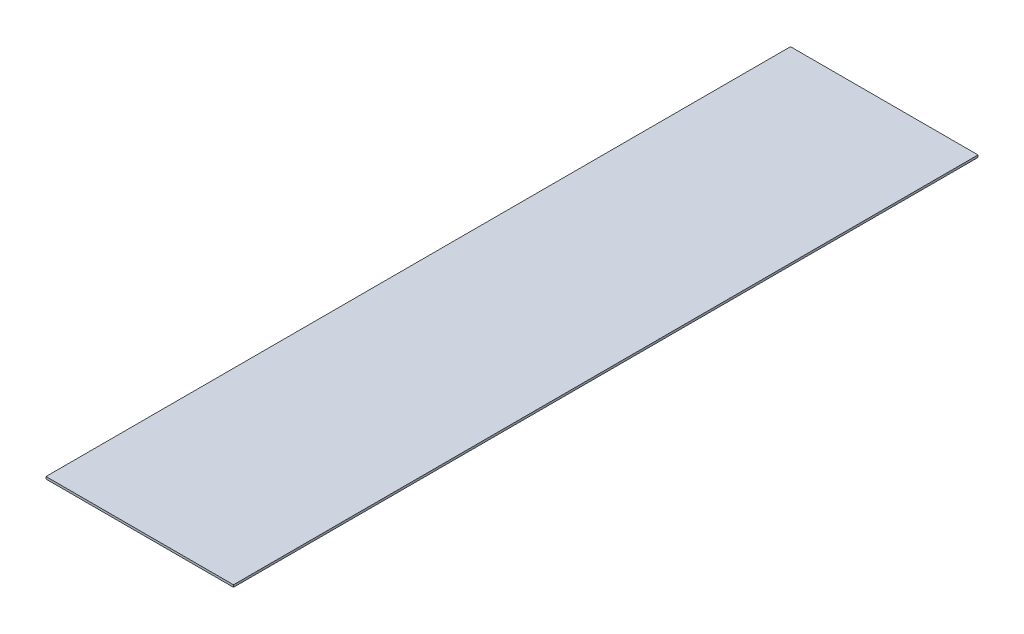
ISO-10303-21;
HEADER;
FILE_DESCRIPTION(('STEP AP214'),'2;1');
FILE_NAME('part.step','',(''),(''),'','','');
FILE_SCHEMA(('AUTOMOTIVE_DESIGN { 1 0 10303 214 1 1 1 1 }'));
ENDSEC;
DATA;
#1=APPLICATION_CONTEXT('core data for automotive mechanical design processes');
#2=APPLICATION_PROTOCOL_DEFINITION('international standard','automotive_design',2000,#1);
#3=PRODUCT_CONTEXT('',#1,'mechanical');
#4=PRODUCT('Part','Part','',(#3));
#5=PRODUCT_RELATED_PRODUCT_CATEGORY('part','',(#4));
#6=PRODUCT_DEFINITION_FORMATION('','',#4);
#7=PRODUCT_DEFINITION_CONTEXT('part definition',#1,'design');
#8=PRODUCT_DEFINITION('design','',#6,#7);
#9=PRODUCT_DEFINITION_SHAPE('','',#8);
#10=(LENGTH_UNIT() NAMED_UNIT(*) SI_UNIT(.MILLI.,.METRE.));
#11=(NAMED_UNIT(*) PLANE_ANGLE_UNIT() SI_UNIT($,.RADIAN.));
#12=(NAMED_UNIT(*) SI_UNIT($,.STERADIAN.) SOLID_ANGLE_UNIT());
#13=UNCERTAINTY_MEASURE_WITH_UNIT(LENGTH_MEASURE(1.E-05),#10,'distance_accuracy_value','');
#14=(GEOMETRIC_REPRESENTATION_CONTEXT(3) GLOBAL_UNCERTAINTY_ASSIGNED_CONTEXT((#13)) GLOBAL_UNIT_ASSIGNED_CONTEXT((#10,
#11,#12)) REPRESENTATION_CONTEXT('',''));
#15=CARTESIAN_POINT('',(0.,0.,0.));
#16=DIRECTION('',(0.,0.,1.));
#17=DIRECTION('',(1.,0.,0.));
#18=AXIS2_PLACEMENT_3D('',#15,#16,#17);
#19=CARTESIAN_POINT('',(-2097.06000099711,-50.,2727.52225433638));
#20=DIRECTION('',(-1.,0.,0.));
#21=DIRECTION('',(0.,0.,1.));
#22=AXIS2_PLACEMENT_3D('',#19,#20,#21);
#23=PLANE('',#22);
#24=DIRECTION('',(0.,0.,1.));
#25=VECTOR('',#24,1.);
#26=CARTESIAN_POINT('',(-2097.06000099711,0.,2727.52225433638));
#27=LINE('',#26,#25);
#28=CARTESIAN_POINT('',(-2097.06000099711,0.,-13927.3312302475));
#29=VERTEX_POINT('',#28);
#30=CARTESIAN_POINT('',(-2097.06000099711,0.,2727.52225433638));
#31=VERTEX_POINT('',#30);
#32=EDGE_CURVE('E105',#29,#31,#27,.T.);
#33=ORIENTED_EDGE('',*,*,#32,.F.);
#34=DIRECTION('',(0.,1.,0.));
#35=VECTOR('',#34,1.);
#36=CARTESIAN_POINT('',(-2097.06000099711,-50.,-13927.3312302475));
#37=LINE('',#36,#35);
#38=CARTESIAN_POINT('',(-2097.06000099711,-50.,-13927.3312302475));
#39=VERTEX_POINT('',#38);
#40=EDGE_CURVE('E11',#39,#29,#37,.T.);
#41=ORIENTED_EDGE('',*,*,#40,.F.);
#42=DIRECTION('',(0.,0.,1.));
#43=VECTOR('',#42,1.);
#44=CARTESIAN_POINT('',(-2097.06000099711,-50.,2727.52225433638));
#45=LINE('',#44,#43);
#46=CARTESIAN_POINT('',(-2097.06000099711,-50.,2727.52225433638));
#47=VERTEX_POINT('',#46);
#48=EDGE_CURVE('E99',#39,#47,#45,.T.);
#49=ORIENTED_EDGE('',*,*,#48,.T.);
#50=DIRECTION('',(0.,1.,0.));
#51=VECTOR('',#50,1.);
#52=CARTESIAN_POINT('',(-2097.06000099711,-50.,2727.52225433638));
#53=LINE('',#52,#51);
#54=EDGE_CURVE('E43',#47,#31,#53,.T.);
#55=ORIENTED_EDGE('',*,*,#54,.T.);
#56=EDGE_LOOP('',(#33,#41,#49,#55));
#57=FACE_BOUND('',#56,.T.);
#58=ADVANCED_FACE('F40',(#57),#23,.T.);
#59=CARTESIAN_POINT('',(-2097.06000099711,-50.,-13927.3312302475));
#60=DIRECTION('',(0.,0.,-1.));
#61=DIRECTION('',(-1.,0.,0.));
#62=AXIS2_PLACEMENT_3D('',#59,#60,#61);
#63=PLANE('',#62);
#64=DIRECTION('',(-1.,0.,0.));
#65=VECTOR('',#64,1.);
#66=CARTESIAN_POINT('',(-2097.06000099711,0.,-13927.3312302475));
#67=LINE('',#66,#65);
#68=CARTESIAN_POINT('',(2097.06000099715,0.,-13927.3312302475));
#69=VERTEX_POINT('',#68);
#70=EDGE_CURVE('E101',#69,#29,#67,.T.);
#71=ORIENTED_EDGE('',*,*,#70,.F.);
#72=DIRECTION('',(0.,1.,0.));
#73=VECTOR('',#72,1.);
#74=CARTESIAN_POINT('',(2097.06000099715,-50.,-13927.3312302475));
#75=LINE('',#74,#73);
#76=CARTESIAN_POINT('',(2097.06000099715,-50.,-13927.3312302475));
#77=VERTEX_POINT('',#76);
#78=EDGE_CURVE('E49',#77,#69,#75,.T.);
#79=ORIENTED_EDGE('',*,*,#78,.F.);
#80=DIRECTION('',(-1.,0.,0.));
#81=VECTOR('',#80,1.);
#82=CARTESIAN_POINT('',(-2097.06000099711,-50.,-13927.3312302475));
#83=LINE('',#82,#81);
#84=EDGE_CURVE('E95',#77,#39,#83,.T.);
#85=ORIENTED_EDGE('',*,*,#84,.T.);
#86=ORIENTED_EDGE('',*,*,#40,.T.);
#87=EDGE_LOOP('',(#71,#79,#85,#86));
#88=FACE_BOUND('',#87,.T.);
#89=ADVANCED_FACE('F116',(#88),#63,.T.);
#90=CARTESIAN_POINT('',(2097.06000099715,-50.,2727.52225433638));
#91=DIRECTION('',(1.,0.,0.));
#92=DIRECTION('',(0.,0.,-1.));
#93=AXIS2_PLACEMENT_3D('',#90,#91,#92);
#94=PLANE('',#93);
#95=DIRECTION('',(0.,0.,-1.));
#96=VECTOR('',#95,1.);
#97=CARTESIAN_POINT('',(2097.06000099715,0.,2727.52225433638));
#98=LINE('',#97,#96);
#99=CARTESIAN_POINT('',(2097.06000099715,0.,2727.52225433638));
#100=VERTEX_POINT('',#99);
#101=EDGE_CURVE('E90',#100,#69,#98,.T.);
#102=ORIENTED_EDGE('',*,*,#101,.F.);
#103=DIRECTION('',(0.,1.,0.));
#104=VECTOR('',#103,1.);
#105=CARTESIAN_POINT('',(2097.06000099715,-50.,2727.52225433638));
#106=LINE('',#105,#104);
#107=CARTESIAN_POINT('',(2097.06000099715,-50.,2727.52225433638));
#108=VERTEX_POINT('',#107);
#109=EDGE_CURVE('E85',#108,#100,#106,.T.);
#110=ORIENTED_EDGE('',*,*,#109,.F.);
#111=DIRECTION('',(0.,0.,-1.));
#112=VECTOR('',#111,1.);
#113=CARTESIAN_POINT('',(2097.06000099715,-50.,2727.52225433638));
#114=LINE('',#113,#112);
#115=EDGE_CURVE('E88',#108,#77,#114,.T.);
#116=ORIENTED_EDGE('',*,*,#115,.T.);
#117=ORIENTED_EDGE('',*,*,#78,.T.);
#118=EDGE_LOOP('',(#102,#110,#116,#117));
#119=FACE_BOUND('',#118,.T.);
#120=ADVANCED_FACE('F87',(#119),#94,.T.);
#121=CARTESIAN_POINT('',(-2097.06000099711,-50.,2727.52225433638));
#122=DIRECTION('',(0.,0.,1.));
#123=DIRECTION('',(1.,0.,0.));
#124=AXIS2_PLACEMENT_3D('',#121,#122,#123);
#125=PLANE('',#124);
#126=DIRECTION('',(1.,0.,0.));
#127=VECTOR('',#126,1.);
#128=CARTESIAN_POINT('',(-2097.06000099711,0.,2727.52225433638));
#129=LINE('',#128,#127);
#130=EDGE_CURVE('E108',#31,#100,#129,.T.);
#131=ORIENTED_EDGE('',*,*,#130,.F.);
#132=ORIENTED_EDGE('',*,*,#54,.F.);
#133=DIRECTION('',(1.,0.,0.));
#134=VECTOR('',#133,1.);
#135=CARTESIAN_POINT('',(-2097.06000099711,-50.,2727.52225433638));
#136=LINE('',#135,#134);
#137=EDGE_CURVE('E94',#47,#108,#136,.T.);
#138=ORIENTED_EDGE('',*,*,#137,.T.);
#139=ORIENTED_EDGE('',*,*,#109,.T.);
#140=EDGE_LOOP('',(#131,#132,#138,#139));
#141=FACE_BOUND('',#140,.T.);
#142=ADVANCED_FACE('F98',(#141),#125,.T.);
#143=CARTESIAN_POINT('',(0.,-50.,0.));
#144=DIRECTION('',(0.,-1.,0.));
#145=DIRECTION('',(0.,0.,-1.));
#146=AXIS2_PLACEMENT_3D('',#143,#144,#145);
#147=PLANE('',#146);
#148=ORIENTED_EDGE('',*,*,#48,.F.);
#149=ORIENTED_EDGE('',*,*,#84,.F.);
#150=ORIENTED_EDGE('',*,*,#115,.F.);
#151=ORIENTED_EDGE('',*,*,#137,.F.);
#152=EDGE_LOOP('',(#148,#149,#150,#151));
#153=FACE_BOUND('',#152,.T.);
#154=ADVANCED_FACE('F93',(#153),#147,.T.);
#155=CARTESIAN_POINT('',(0.,0.,0.));
#156=DIRECTION('',(0.,-1.,0.));
#157=DIRECTION('',(0.,0.,-1.));
#158=AXIS2_PLACEMENT_3D('',#155,#156,#157);
#159=PLANE('',#158);
#160=ORIENTED_EDGE('',*,*,#32,.T.);
#161=ORIENTED_EDGE('',*,*,#130,.T.);
#162=ORIENTED_EDGE('',*,*,#101,.T.);
#163=ORIENTED_EDGE('',*,*,#70,.T.);
#164=EDGE_LOOP('',(#160,#161,#162,#163));
#165=FACE_BOUND('',#164,.T.);
#166=ADVANCED_FACE('F115',(#165),#159,.F.);
#167=CLOSED_SHELL('',(#58,#89,#120,#142,#154,#166));
#168=MANIFOLD_SOLID_BREP('B2',#167);
#169=ADVANCED_BREP_SHAPE_REPRESENTATION('',(#18,#168),#14);
#170=SHAPE_DEFINITION_REPRESENTATION(#9,#169);
ENDSEC;
END-ISO-10303-21;
